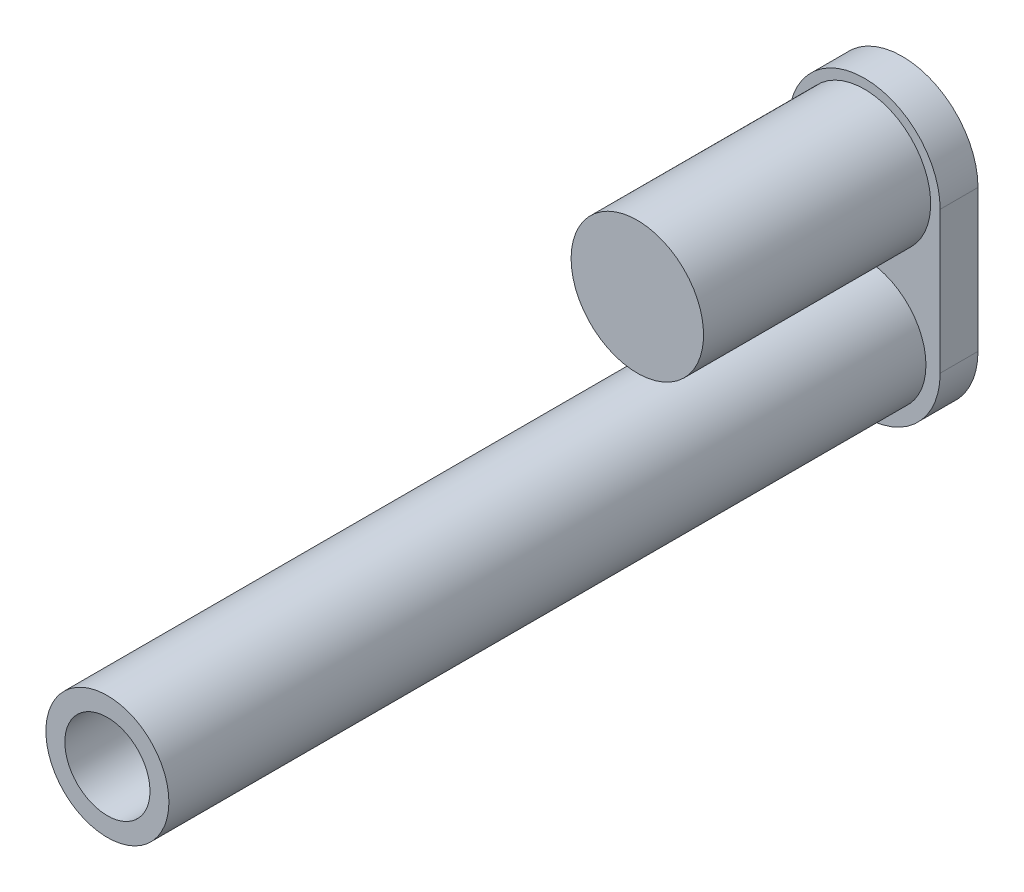
ISO-10303-21;
HEADER;
FILE_DESCRIPTION(('STEP AP214'),'2;1');
FILE_NAME('part.step','',(''),(''),'','','');
FILE_SCHEMA(('AUTOMOTIVE_DESIGN { 1 0 10303 214 1 1 1 1 }'));
ENDSEC;
DATA;
#1=APPLICATION_CONTEXT('core data for automotive mechanical design processes');
#2=APPLICATION_PROTOCOL_DEFINITION('international standard','automotive_design',2000,#1);
#3=PRODUCT_CONTEXT('',#1,'mechanical');
#4=PRODUCT('Part','Part','',(#3));
#5=PRODUCT_RELATED_PRODUCT_CATEGORY('part','',(#4));
#6=PRODUCT_DEFINITION_FORMATION('','',#4);
#7=PRODUCT_DEFINITION_CONTEXT('part definition',#1,'design');
#8=PRODUCT_DEFINITION('design','',#6,#7);
#9=PRODUCT_DEFINITION_SHAPE('','',#8);
#10=(LENGTH_UNIT() NAMED_UNIT(*) SI_UNIT(.MILLI.,.METRE.));
#11=(NAMED_UNIT(*) PLANE_ANGLE_UNIT() SI_UNIT($,.RADIAN.));
#12=(NAMED_UNIT(*) SI_UNIT($,.STERADIAN.) SOLID_ANGLE_UNIT());
#13=UNCERTAINTY_MEASURE_WITH_UNIT(LENGTH_MEASURE(1.E-05),#10,'distance_accuracy_value','');
#14=(GEOMETRIC_REPRESENTATION_CONTEXT(3) GLOBAL_UNCERTAINTY_ASSIGNED_CONTEXT((#13)) GLOBAL_UNIT_ASSIGNED_CONTEXT((#10,
#11,#12)) REPRESENTATION_CONTEXT('',''));
#15=CARTESIAN_POINT('',(0.,0.,0.));
#16=DIRECTION('',(0.,0.,1.));
#17=DIRECTION('',(1.,0.,0.));
#18=AXIS2_PLACEMENT_3D('',#15,#16,#17);
#19=CARTESIAN_POINT('',(0.,0.,0.));
#20=DIRECTION('',(0.,0.,1.));
#21=DIRECTION('',(1.,0.,0.));
#22=AXIS2_PLACEMENT_3D('',#19,#20,#21);
#23=PLANE('',#22);
#24=CARTESIAN_POINT('',(0.,0.,0.));
#25=DIRECTION('',(0.,0.,1.));
#26=DIRECTION('',(1.,0.,0.));
#27=AXIS2_PLACEMENT_3D('',#24,#25,#26);
#28=CIRCLE('',#27,25.4);
#29=CARTESIAN_POINT('',(-25.4,0.,0.));
#30=VERTEX_POINT('',#29);
#31=CARTESIAN_POINT('',(25.4,0.,0.));
#32=VERTEX_POINT('',#31);
#33=EDGE_CURVE('E160',#30,#32,#28,.T.);
#34=ORIENTED_EDGE('',*,*,#33,.F.);
#35=DIRECTION('',(0.,-1.,0.));
#36=VECTOR('',#35,1.);
#37=CARTESIAN_POINT('',(-25.4,0.,0.));
#38=LINE('',#37,#36);
#39=CARTESIAN_POINT('',(-25.4,47.625,0.));
#40=VERTEX_POINT('',#39);
#41=EDGE_CURVE('E84',#40,#30,#38,.T.);
#42=ORIENTED_EDGE('',*,*,#41,.F.);
#43=CARTESIAN_POINT('',(0.,47.625,0.));
#44=DIRECTION('',(0.,0.,1.));
#45=DIRECTION('',(1.,0.,0.));
#46=AXIS2_PLACEMENT_3D('',#43,#44,#45);
#47=CIRCLE('',#46,25.4);
#48=CARTESIAN_POINT('',(25.4,47.625,0.));
#49=VERTEX_POINT('',#48);
#50=EDGE_CURVE('E174',#49,#40,#47,.T.);
#51=ORIENTED_EDGE('',*,*,#50,.F.);
#52=DIRECTION('',(0.,1.,0.));
#53=VECTOR('',#52,1.);
#54=CARTESIAN_POINT('',(25.4,0.,0.));
#55=LINE('',#54,#53);
#56=EDGE_CURVE('E172',#32,#49,#55,.T.);
#57=ORIENTED_EDGE('',*,*,#56,.F.);
#58=EDGE_LOOP('',(#34,#42,#51,#57));
#59=FACE_BOUND('',#58,.T.);
#60=DIRECTION('',(0.,-1.,0.));
#61=VECTOR('',#60,1.);
#62=CARTESIAN_POINT('',(-6.35,6.35,0.));
#63=LINE('',#62,#61);
#64=CARTESIAN_POINT('',(-6.35,6.35,0.));
#65=VERTEX_POINT('',#64);
#66=CARTESIAN_POINT('',(-6.35,-6.35,0.));
#67=VERTEX_POINT('',#66);
#68=EDGE_CURVE('E133',#65,#67,#63,.T.);
#69=ORIENTED_EDGE('',*,*,#68,.T.);
#70=DIRECTION('',(1.,0.,0.));
#71=VECTOR('',#70,1.);
#72=CARTESIAN_POINT('',(-6.35,-6.35,0.));
#73=LINE('',#72,#71);
#74=CARTESIAN_POINT('',(6.35,-6.35,0.));
#75=VERTEX_POINT('',#74);
#76=EDGE_CURVE('E118',#67,#75,#73,.T.);
#77=ORIENTED_EDGE('',*,*,#76,.T.);
#78=DIRECTION('',(0.,-1.,0.));
#79=VECTOR('',#78,1.);
#80=CARTESIAN_POINT('',(6.35,6.35,0.));
#81=LINE('',#80,#79);
#82=CARTESIAN_POINT('',(6.35,6.35,0.));
#83=VERTEX_POINT('',#82);
#84=EDGE_CURVE('E123',#83,#75,#81,.T.);
#85=ORIENTED_EDGE('',*,*,#84,.F.);
#86=DIRECTION('',(1.,0.,0.));
#87=VECTOR('',#86,1.);
#88=CARTESIAN_POINT('',(-6.35,6.35,0.));
#89=LINE('',#88,#87);
#90=EDGE_CURVE('E150',#65,#83,#89,.T.);
#91=ORIENTED_EDGE('',*,*,#90,.F.);
#92=EDGE_LOOP('',(#69,#77,#85,#91));
#93=FACE_BOUND('',#92,.T.);
#94=ADVANCED_FACE('F39',(#59,#93),#23,.F.);
#95=CARTESIAN_POINT('',(0.,0.,12.7));
#96=DIRECTION('',(0.,0.,-1.));
#97=DIRECTION('',(-1.,0.,0.));
#98=AXIS2_PLACEMENT_3D('',#95,#96,#97);
#99=CYLINDRICAL_SURFACE('',#98,25.4);
#100=ORIENTED_EDGE('',*,*,#33,.T.);
#101=DIRECTION('',(0.,0.,-1.));
#102=VECTOR('',#101,1.);
#103=CARTESIAN_POINT('',(25.4,0.,12.7));
#104=LINE('',#103,#102);
#105=CARTESIAN_POINT('',(25.4,0.,12.7));
#106=VERTEX_POINT('',#105);
#107=EDGE_CURVE('E11',#106,#32,#104,.T.);
#108=ORIENTED_EDGE('',*,*,#107,.F.);
#109=CARTESIAN_POINT('',(0.,0.,12.7));
#110=DIRECTION('',(0.,0.,1.));
#111=DIRECTION('',(1.,0.,0.));
#112=AXIS2_PLACEMENT_3D('',#109,#110,#111);
#113=CIRCLE('',#112,25.4);
#114=CARTESIAN_POINT('',(-25.4,0.,12.7));
#115=VERTEX_POINT('',#114);
#116=EDGE_CURVE('E163',#115,#106,#113,.T.);
#117=ORIENTED_EDGE('',*,*,#116,.F.);
#118=DIRECTION('',(0.,0.,-1.));
#119=VECTOR('',#118,1.);
#120=CARTESIAN_POINT('',(-25.4,0.,12.7));
#121=LINE('',#120,#119);
#122=EDGE_CURVE('E169',#115,#30,#121,.T.);
#123=ORIENTED_EDGE('',*,*,#122,.T.);
#124=EDGE_LOOP('',(#100,#108,#117,#123));
#125=FACE_BOUND('',#124,.T.);
#126=ADVANCED_FACE('F41',(#125),#99,.T.);
#127=CARTESIAN_POINT('',(25.4,0.,12.7));
#128=DIRECTION('',(-1.,0.,0.));
#129=DIRECTION('',(0.,0.,1.));
#130=AXIS2_PLACEMENT_3D('',#127,#128,#129);
#131=PLANE('',#130);
#132=ORIENTED_EDGE('',*,*,#56,.T.);
#133=DIRECTION('',(0.,0.,-1.));
#134=VECTOR('',#133,1.);
#135=CARTESIAN_POINT('',(25.4,47.625,12.7));
#136=LINE('',#135,#134);
#137=CARTESIAN_POINT('',(25.4,47.625,12.7));
#138=VERTEX_POINT('',#137);
#139=EDGE_CURVE('E47',#138,#49,#136,.T.);
#140=ORIENTED_EDGE('',*,*,#139,.F.);
#141=DIRECTION('',(0.,1.,0.));
#142=VECTOR('',#141,1.);
#143=CARTESIAN_POINT('',(25.4,0.,12.7));
#144=LINE('',#143,#142);
#145=EDGE_CURVE('E91',#106,#138,#144,.T.);
#146=ORIENTED_EDGE('',*,*,#145,.F.);
#147=ORIENTED_EDGE('',*,*,#107,.T.);
#148=EDGE_LOOP('',(#132,#140,#146,#147));
#149=FACE_BOUND('',#148,.T.);
#150=ADVANCED_FACE('F202',(#149),#131,.F.);
#151=CARTESIAN_POINT('',(0.,47.625,12.7));
#152=DIRECTION('',(0.,0.,-1.));
#153=DIRECTION('',(-1.,0.,0.));
#154=AXIS2_PLACEMENT_3D('',#151,#152,#153);
#155=CYLINDRICAL_SURFACE('',#154,25.4);
#156=ORIENTED_EDGE('',*,*,#50,.T.);
#157=DIRECTION('',(0.,0.,-1.));
#158=VECTOR('',#157,1.);
#159=CARTESIAN_POINT('',(-25.4,47.625,12.7));
#160=LINE('',#159,#158);
#161=CARTESIAN_POINT('',(-25.4,47.625,12.7));
#162=VERTEX_POINT('',#161);
#163=EDGE_CURVE('E178',#162,#40,#160,.T.);
#164=ORIENTED_EDGE('',*,*,#163,.F.);
#165=CARTESIAN_POINT('',(0.,47.625,12.7));
#166=DIRECTION('',(0.,0.,1.));
#167=DIRECTION('',(1.,0.,0.));
#168=AXIS2_PLACEMENT_3D('',#165,#166,#167);
#169=CIRCLE('',#168,25.4);
#170=EDGE_CURVE('E166',#138,#162,#169,.T.);
#171=ORIENTED_EDGE('',*,*,#170,.F.);
#172=ORIENTED_EDGE('',*,*,#139,.T.);
#173=EDGE_LOOP('',(#156,#164,#171,#172));
#174=FACE_BOUND('',#173,.T.);
#175=ADVANCED_FACE('F183',(#174),#155,.T.);
#176=CARTESIAN_POINT('',(-25.4,0.,12.7));
#177=DIRECTION('',(1.,0.,0.));
#178=DIRECTION('',(0.,0.,-1.));
#179=AXIS2_PLACEMENT_3D('',#176,#177,#178);
#180=PLANE('',#179);
#181=ORIENTED_EDGE('',*,*,#41,.T.);
#182=ORIENTED_EDGE('',*,*,#122,.F.);
#183=DIRECTION('',(0.,-1.,0.));
#184=VECTOR('',#183,1.);
#185=CARTESIAN_POINT('',(-25.4,0.,12.7));
#186=LINE('',#185,#184);
#187=EDGE_CURVE('E63',#162,#115,#186,.T.);
#188=ORIENTED_EDGE('',*,*,#187,.F.);
#189=ORIENTED_EDGE('',*,*,#163,.T.);
#190=EDGE_LOOP('',(#181,#182,#188,#189));
#191=FACE_BOUND('',#190,.T.);
#192=ADVANCED_FACE('F190',(#191),#180,.F.);
#193=CARTESIAN_POINT('',(0.,0.,12.7));
#194=DIRECTION('',(0.,0.,1.));
#195=DIRECTION('',(1.,0.,0.));
#196=AXIS2_PLACEMENT_3D('',#193,#194,#195);
#197=PLANE('',#196);
#198=CARTESIAN_POINT('',(0.,0.,12.7));
#199=DIRECTION('',(0.,0.,1.));
#200=DIRECTION('',(1.,0.,0.));
#201=AXIS2_PLACEMENT_3D('',#198,#199,#200);
#202=CIRCLE('',#201,20.6375);
#203=CARTESIAN_POINT('',(20.6375,0.,12.7));
#204=VERTEX_POINT('',#203);
#205=EDGE_CURVE('E146',#204,#204,#202,.T.);
#206=ORIENTED_EDGE('',*,*,#205,.F.);
#207=EDGE_LOOP('',(#206));
#208=FACE_BOUND('',#207,.T.);
#209=CARTESIAN_POINT('',(0.,47.625,12.7));
#210=DIRECTION('',(0.,0.,1.));
#211=DIRECTION('',(1.,0.,0.));
#212=AXIS2_PLACEMENT_3D('',#209,#210,#211);
#213=CIRCLE('',#212,22.225);
#214=CARTESIAN_POINT('',(-22.225,47.625,12.7));
#215=VERTEX_POINT('',#214);
#216=EDGE_CURVE('E154',#215,#215,#213,.T.);
#217=ORIENTED_EDGE('',*,*,#216,.F.);
#218=EDGE_LOOP('',(#217));
#219=FACE_BOUND('',#218,.T.);
#220=ORIENTED_EDGE('',*,*,#116,.T.);
#221=ORIENTED_EDGE('',*,*,#145,.T.);
#222=ORIENTED_EDGE('',*,*,#170,.T.);
#223=ORIENTED_EDGE('',*,*,#187,.T.);
#224=EDGE_LOOP('',(#220,#221,#222,#223));
#225=FACE_BOUND('',#224,.T.);
#226=ADVANCED_FACE('F192',(#208,#219,#225),#197,.T.);
#227=CARTESIAN_POINT('',(0.,47.625,88.9));
#228=DIRECTION('',(0.,0.,-1.));
#229=DIRECTION('',(-1.,0.,0.));
#230=AXIS2_PLACEMENT_3D('',#227,#228,#229);
#231=CYLINDRICAL_SURFACE('',#230,22.225);
#232=CARTESIAN_POINT('',(0.,47.625,88.9));
#233=DIRECTION('',(0.,0.,1.));
#234=DIRECTION('',(1.,0.,0.));
#235=AXIS2_PLACEMENT_3D('',#232,#233,#234);
#236=CIRCLE('',#235,22.225);
#237=CARTESIAN_POINT('',(-22.225,47.625,88.9));
#238=VERTEX_POINT('',#237);
#239=EDGE_CURVE('E157',#238,#238,#236,.T.);
#240=CARTESIAN_POINT('',(-22.225,47.625,88.9));
#241=CARTESIAN_POINT('',(-22.225,47.625,88.10625));
#242=CARTESIAN_POINT('',(-22.225,47.625,87.3125));
#243=CARTESIAN_POINT('',(-22.225,47.625,85.725));
#244=CARTESIAN_POINT('',(-22.225,47.625,84.93125));
#245=CARTESIAN_POINT('',(-22.225,47.625,83.34375));
#246=CARTESIAN_POINT('',(-22.225,47.625,82.55));
#247=CARTESIAN_POINT('',(-22.225,47.625,80.9625));
#248=CARTESIAN_POINT('',(-22.225,47.625,80.16875));
#249=CARTESIAN_POINT('',(-22.225,47.625,78.58125));
#250=CARTESIAN_POINT('',(-22.225,47.625,77.7875));
#251=CARTESIAN_POINT('',(-22.225,47.625,76.2));
#252=CARTESIAN_POINT('',(-22.225,47.625,75.40625));
#253=CARTESIAN_POINT('',(-22.225,47.625,73.81875));
#254=CARTESIAN_POINT('',(-22.225,47.625,73.025));
#255=CARTESIAN_POINT('',(-22.225,47.625,71.4375));
#256=CARTESIAN_POINT('',(-22.225,47.625,70.64375));
#257=CARTESIAN_POINT('',(-22.225,47.625,69.05625));
#258=CARTESIAN_POINT('',(-22.225,47.625,68.2625));
#259=CARTESIAN_POINT('',(-22.225,47.625,66.675));
#260=CARTESIAN_POINT('',(-22.225,47.625,65.88125));
#261=CARTESIAN_POINT('',(-22.225,47.625,64.29375));
#262=CARTESIAN_POINT('',(-22.225,47.625,63.5));
#263=CARTESIAN_POINT('',(-22.225,47.625,61.9125));
#264=CARTESIAN_POINT('',(-22.225,47.625,61.11875));
#265=CARTESIAN_POINT('',(-22.225,47.625,59.53125));
#266=CARTESIAN_POINT('',(-22.225,47.625,58.7375));
#267=CARTESIAN_POINT('',(-22.225,47.625,57.15));
#268=CARTESIAN_POINT('',(-22.225,47.625,56.35625));
#269=CARTESIAN_POINT('',(-22.225,47.625,54.76875));
#270=CARTESIAN_POINT('',(-22.225,47.625,53.975));
#271=CARTESIAN_POINT('',(-22.225,47.625,52.3875));
#272=CARTESIAN_POINT('',(-22.225,47.625,51.59375));
#273=CARTESIAN_POINT('',(-22.225,47.625,50.00625));
#274=CARTESIAN_POINT('',(-22.225,47.625,49.2125));
#275=CARTESIAN_POINT('',(-22.225,47.625,47.625));
#276=CARTESIAN_POINT('',(-22.225,47.625,46.83125));
#277=CARTESIAN_POINT('',(-22.225,47.625,45.24375));
#278=CARTESIAN_POINT('',(-22.225,47.625,44.45));
#279=CARTESIAN_POINT('',(-22.225,47.625,42.8625));
#280=CARTESIAN_POINT('',(-22.225,47.625,42.06875));
#281=CARTESIAN_POINT('',(-22.225,47.625,40.48125));
#282=CARTESIAN_POINT('',(-22.225,47.625,39.6875));
#283=CARTESIAN_POINT('',(-22.225,47.625,38.1));
#284=CARTESIAN_POINT('',(-22.225,47.625,37.30625));
#285=CARTESIAN_POINT('',(-22.225,47.625,35.71875));
#286=CARTESIAN_POINT('',(-22.225,47.625,34.925));
#287=CARTESIAN_POINT('',(-22.225,47.625,33.3375));
#288=CARTESIAN_POINT('',(-22.225,47.625,32.54375));
#289=CARTESIAN_POINT('',(-22.225,47.625,30.95625));
#290=CARTESIAN_POINT('',(-22.225,47.625,30.1625));
#291=CARTESIAN_POINT('',(-22.225,47.625,28.575));
#292=CARTESIAN_POINT('',(-22.225,47.625,27.78125));
#293=CARTESIAN_POINT('',(-22.225,47.625,26.19375));
#294=CARTESIAN_POINT('',(-22.225,47.625,25.4));
#295=CARTESIAN_POINT('',(-22.225,47.625,23.8125));
#296=CARTESIAN_POINT('',(-22.225,47.625,23.01875));
#297=CARTESIAN_POINT('',(-22.225,47.625,21.43125));
#298=CARTESIAN_POINT('',(-22.225,47.625,20.6375));
#299=CARTESIAN_POINT('',(-22.225,47.625,19.05));
#300=CARTESIAN_POINT('',(-22.225,47.625,18.25625));
#301=CARTESIAN_POINT('',(-22.225,47.625,16.66875));
#302=CARTESIAN_POINT('',(-22.225,47.625,15.875));
#303=CARTESIAN_POINT('',(-22.225,47.625,14.2875));
#304=CARTESIAN_POINT('',(-22.225,47.625,13.49375));
#305=CARTESIAN_POINT('',(-22.225,47.625,12.7));
#306=B_SPLINE_CURVE_WITH_KNOTS('',3,(#240,#241,#242,#243,#244,#245,#246,#247,#248,#249,#250,
#251,#252,#253,#254,#255,#256,#257,#258,#259,#260,#261,#262,#263,#264,#265,#266,#267,#268,#269,
#270,#271,#272,#273,#274,#275,#276,#277,#278,#279,#280,#281,#282,#283,#284,#285,#286,#287,#288,
#289,#290,#291,#292,#293,#294,#295,#296,#297,#298,#299,#300,#301,#302,#303,#304,#305),
.UNSPECIFIED.,.F.,.F.,(4,2,2,2,2,2,2,2,2,2,2,2,2,2,2,2,2,2,2,2,2,2,2,2,2,2,2,2,2,2,2,2,4),(0.,
2.38124999999999,4.76249999999999,7.14374999999999,9.52499999999999,11.90625,14.2875,16.66875,
19.05,21.43125,23.8125,26.19375,28.575,30.95625,33.3375,35.71875,38.1,40.48125,42.8625,45.24375,
47.625,50.00625,52.3875,54.76875,57.15,59.53125,61.9125,64.29375,66.675,69.05625,71.4375,
73.81875,76.2),.UNSPECIFIED.);
#307=EDGE_CURVE('BSEAM199',#238,#215,#306,.T.);
#308=ORIENTED_EDGE('',*,*,#239,.F.);
#309=ORIENTED_EDGE('',*,*,#216,.T.);
#310=ORIENTED_EDGE('',*,*,#307,.T.);
#311=ORIENTED_EDGE('',*,*,#307,.F.);
#312=EDGE_LOOP('',(#308,#310,#309,#311));
#313=FACE_BOUND('',#312,.T.);
#314=ADVANCED_FACE('F199',(#313),#231,.T.);
#315=CARTESIAN_POINT('',(0.,47.625,88.9));
#316=DIRECTION('',(0.,0.,1.));
#317=DIRECTION('',(1.,0.,0.));
#318=AXIS2_PLACEMENT_3D('',#315,#316,#317);
#319=PLANE('',#318);
#320=ORIENTED_EDGE('',*,*,#239,.T.);
#321=EDGE_LOOP('',(#320));
#322=FACE_BOUND('',#321,.T.);
#323=ADVANCED_FACE('F213',(#322),#319,.T.);
#324=CARTESIAN_POINT('',(0.,0.,266.7));
#325=DIRECTION('',(0.,0.,-1.));
#326=DIRECTION('',(-1.,0.,0.));
#327=AXIS2_PLACEMENT_3D('',#324,#325,#326);
#328=CYLINDRICAL_SURFACE('',#327,20.6375);
#329=CARTESIAN_POINT('',(0.,0.,266.7));
#330=DIRECTION('',(0.,0.,1.));
#331=DIRECTION('',(1.,0.,0.));
#332=AXIS2_PLACEMENT_3D('',#329,#330,#331);
#333=CIRCLE('',#332,20.6375);
#334=CARTESIAN_POINT('',(20.6375,0.,266.7));
#335=VERTEX_POINT('',#334);
#336=EDGE_CURVE('E151',#335,#335,#333,.T.);
#337=ORIENTED_EDGE('',*,*,#336,.F.);
#338=EDGE_LOOP('',(#337));
#339=FACE_BOUND('',#338,.T.);
#340=ORIENTED_EDGE('',*,*,#205,.T.);
#341=EDGE_LOOP('',(#340));
#342=FACE_BOUND('',#341,.T.);
#343=ADVANCED_FACE('F217',(#339,#342),#328,.T.);
#344=CARTESIAN_POINT('',(0.,0.,266.7));
#345=DIRECTION('',(0.,0.,1.));
#346=DIRECTION('',(1.,0.,0.));
#347=AXIS2_PLACEMENT_3D('',#344,#345,#346);
#348=PLANE('',#347);
#349=CARTESIAN_POINT('',(0.,0.,266.7));
#350=DIRECTION('',(0.,0.,1.));
#351=DIRECTION('',(1.,0.,0.));
#352=AXIS2_PLACEMENT_3D('',#349,#350,#351);
#353=CIRCLE('',#352,14.2875);
#354=CARTESIAN_POINT('',(14.2875,0.,266.7));
#355=VERTEX_POINT('',#354);
#356=EDGE_CURVE('E147',#355,#355,#353,.T.);
#357=ORIENTED_EDGE('',*,*,#356,.F.);
#358=EDGE_LOOP('',(#357));
#359=FACE_BOUND('',#358,.T.);
#360=ORIENTED_EDGE('',*,*,#336,.T.);
#361=EDGE_LOOP('',(#360));
#362=FACE_BOUND('',#361,.T.);
#363=ADVANCED_FACE('F221',(#359,#362),#348,.T.);
#364=CARTESIAN_POINT('',(0.,0.,63.5));
#365=DIRECTION('',(0.,0.,1.));
#366=DIRECTION('',(1.,0.,0.));
#367=AXIS2_PLACEMENT_3D('',#364,#365,#366);
#368=CYLINDRICAL_SURFACE('',#367,14.2875);
#369=CARTESIAN_POINT('',(0.,0.,63.5));
#370=DIRECTION('',(0.,0.,1.));
#371=DIRECTION('',(1.,0.,0.));
#372=AXIS2_PLACEMENT_3D('',#369,#370,#371);
#373=CIRCLE('',#372,14.2875);
#374=CARTESIAN_POINT('',(14.2875,0.,63.5));
#375=VERTEX_POINT('',#374);
#376=EDGE_CURVE('E143',#375,#375,#373,.T.);
#377=ORIENTED_EDGE('',*,*,#376,.F.);
#378=EDGE_LOOP('',(#377));
#379=FACE_BOUND('',#378,.T.);
#380=ORIENTED_EDGE('',*,*,#356,.T.);
#381=EDGE_LOOP('',(#380));
#382=FACE_BOUND('',#381,.T.);
#383=ADVANCED_FACE('F225',(#379,#382),#368,.F.);
#384=CARTESIAN_POINT('',(0.,0.,63.5));
#385=DIRECTION('',(0.,0.,1.));
#386=DIRECTION('',(1.,0.,0.));
#387=AXIS2_PLACEMENT_3D('',#384,#385,#386);
#388=PLANE('',#387);
#389=ORIENTED_EDGE('',*,*,#376,.T.);
#390=EDGE_LOOP('',(#389));
#391=FACE_BOUND('',#390,.T.);
#392=ADVANCED_FACE('F229',(#391),#388,.T.);
#393=CARTESIAN_POINT('',(-6.35,6.35,0.));
#394=DIRECTION('',(0.,1.,0.));
#395=DIRECTION('',(0.,0.,1.));
#396=AXIS2_PLACEMENT_3D('',#393,#394,#395);
#397=PLANE('',#396);
#398=ORIENTED_EDGE('',*,*,#90,.T.);
#399=DIRECTION('',(0.,0.,1.));
#400=VECTOR('',#399,1.);
#401=CARTESIAN_POINT('',(6.35,6.35,0.));
#402=LINE('',#401,#400);
#403=CARTESIAN_POINT('',(6.35,6.35,-12.7));
#404=VERTEX_POINT('',#403);
#405=EDGE_CURVE('E54',#404,#83,#402,.T.);
#406=ORIENTED_EDGE('',*,*,#405,.F.);
#407=DIRECTION('',(1.,0.,0.));
#408=VECTOR('',#407,1.);
#409=CARTESIAN_POINT('',(-6.35,6.35,-12.7));
#410=LINE('',#409,#408);
#411=CARTESIAN_POINT('',(-6.35,6.35,-12.7));
#412=VERTEX_POINT('',#411);
#413=EDGE_CURVE('E136',#412,#404,#410,.T.);
#414=ORIENTED_EDGE('',*,*,#413,.F.);
#415=DIRECTION('',(0.,0.,1.));
#416=VECTOR('',#415,1.);
#417=CARTESIAN_POINT('',(-6.35,6.35,0.));
#418=LINE('',#417,#416);
#419=EDGE_CURVE('E134',#412,#65,#418,.T.);
#420=ORIENTED_EDGE('',*,*,#419,.T.);
#421=EDGE_LOOP('',(#398,#406,#414,#420));
#422=FACE_BOUND('',#421,.T.);
#423=ADVANCED_FACE('F232',(#422),#397,.T.);
#424=CARTESIAN_POINT('',(-6.35,6.35,-12.7));
#425=DIRECTION('',(0.,0.,-1.));
#426=DIRECTION('',(-1.,0.,0.));
#427=AXIS2_PLACEMENT_3D('',#424,#425,#426);
#428=PLANE('',#427);
#429=ORIENTED_EDGE('',*,*,#413,.T.);
#430=DIRECTION('',(0.,1.,0.));
#431=VECTOR('',#430,1.);
#432=CARTESIAN_POINT('',(6.35,6.35,-12.7));
#433=LINE('',#432,#431);
#434=CARTESIAN_POINT('',(6.35,-6.35,-12.7));
#435=VERTEX_POINT('',#434);
#436=EDGE_CURVE('E122',#435,#404,#433,.T.);
#437=ORIENTED_EDGE('',*,*,#436,.F.);
#438=DIRECTION('',(1.,0.,0.));
#439=VECTOR('',#438,1.);
#440=CARTESIAN_POINT('',(-6.35,-6.35,-12.7));
#441=LINE('',#440,#439);
#442=CARTESIAN_POINT('',(-6.35,-6.35,-12.7));
#443=VERTEX_POINT('',#442);
#444=EDGE_CURVE('E120',#443,#435,#441,.T.);
#445=ORIENTED_EDGE('',*,*,#444,.F.);
#446=DIRECTION('',(0.,1.,0.));
#447=VECTOR('',#446,1.);
#448=CARTESIAN_POINT('',(-6.35,6.35,-12.7));
#449=LINE('',#448,#447);
#450=EDGE_CURVE('E139',#443,#412,#449,.T.);
#451=ORIENTED_EDGE('',*,*,#450,.T.);
#452=EDGE_LOOP('',(#429,#437,#445,#451));
#453=FACE_BOUND('',#452,.T.);
#454=ADVANCED_FACE('F237',(#453),#428,.T.);
#455=CARTESIAN_POINT('',(-6.35,-6.35,0.));
#456=DIRECTION('',(0.,-1.,0.));
#457=DIRECTION('',(0.,0.,-1.));
#458=AXIS2_PLACEMENT_3D('',#455,#456,#457);
#459=PLANE('',#458);
#460=ORIENTED_EDGE('',*,*,#444,.T.);
#461=DIRECTION('',(0.,0.,-1.));
#462=VECTOR('',#461,1.);
#463=CARTESIAN_POINT('',(6.35,-6.35,0.));
#464=LINE('',#463,#462);
#465=EDGE_CURVE('E114',#75,#435,#464,.T.);
#466=ORIENTED_EDGE('',*,*,#465,.F.);
#467=ORIENTED_EDGE('',*,*,#76,.F.);
#468=DIRECTION('',(0.,0.,-1.));
#469=VECTOR('',#468,1.);
#470=CARTESIAN_POINT('',(-6.35,-6.35,0.));
#471=LINE('',#470,#469);
#472=EDGE_CURVE('E368',#67,#443,#471,.T.);
#473=ORIENTED_EDGE('',*,*,#472,.T.);
#474=EDGE_LOOP('',(#460,#466,#467,#473));
#475=FACE_BOUND('',#474,.T.);
#476=ADVANCED_FACE('F115',(#475),#459,.T.);
#477=CARTESIAN_POINT('',(-6.35,0.,0.));
#478=DIRECTION('',(1.,0.,0.));
#479=DIRECTION('',(0.,0.,-1.));
#480=AXIS2_PLACEMENT_3D('',#477,#478,#479);
#481=PLANE('',#480);
#482=CARTESIAN_POINT('',(-6.35,0.,-7.9375));
#483=DIRECTION('',(1.,0.,0.));
#484=DIRECTION('',(0.,0.,-1.));
#485=AXIS2_PLACEMENT_3D('',#482,#483,#484);
#486=CIRCLE('',#485,3.17500000000001);
#487=CARTESIAN_POINT('',(-6.35,0.,-11.1125));
#488=VERTEX_POINT('',#487);
#489=EDGE_CURVE('E359',#488,#488,#486,.T.);
#490=ORIENTED_EDGE('',*,*,#489,.T.);
#491=EDGE_LOOP('',(#490));
#492=FACE_BOUND('',#491,.T.);
#493=ORIENTED_EDGE('',*,*,#68,.F.);
#494=ORIENTED_EDGE('',*,*,#419,.F.);
#495=ORIENTED_EDGE('',*,*,#450,.F.);
#496=ORIENTED_EDGE('',*,*,#472,.F.);
#497=EDGE_LOOP('',(#493,#494,#495,#496));
#498=FACE_BOUND('',#497,.T.);
#499=ADVANCED_FACE('F236',(#492,#498),#481,.F.);
#500=CARTESIAN_POINT('',(-6.35,0.,-7.9375));
#501=DIRECTION('',(1.,0.,0.));
#502=DIRECTION('',(0.,0.,-1.));
#503=AXIS2_PLACEMENT_3D('',#500,#501,#502);
#504=CYLINDRICAL_SURFACE('',#503,3.17500000000001);
#505=ORIENTED_EDGE('',*,*,#489,.F.);
#506=EDGE_LOOP('',(#505));
#507=FACE_BOUND('',#506,.T.);
#508=CARTESIAN_POINT('',(6.35,0.,-7.9375));
#509=DIRECTION('',(1.,0.,0.));
#510=DIRECTION('',(0.,0.,-1.));
#511=AXIS2_PLACEMENT_3D('',#508,#509,#510);
#512=CIRCLE('',#511,3.17500000000001);
#513=CARTESIAN_POINT('',(6.35,0.,-11.1125));
#514=VERTEX_POINT('',#513);
#515=EDGE_CURVE('E130',#514,#514,#512,.T.);
#516=ORIENTED_EDGE('',*,*,#515,.T.);
#517=EDGE_LOOP('',(#516));
#518=FACE_BOUND('',#517,.T.);
#519=ADVANCED_FACE('F245',(#507,#518),#504,.F.);
#520=CARTESIAN_POINT('',(6.35,0.,0.));
#521=DIRECTION('',(1.,0.,0.));
#522=DIRECTION('',(0.,0.,-1.));
#523=AXIS2_PLACEMENT_3D('',#520,#521,#522);
#524=PLANE('',#523);
#525=ORIENTED_EDGE('',*,*,#84,.T.);
#526=ORIENTED_EDGE('',*,*,#465,.T.);
#527=ORIENTED_EDGE('',*,*,#436,.T.);
#528=ORIENTED_EDGE('',*,*,#405,.T.);
#529=EDGE_LOOP('',(#525,#526,#527,#528));
#530=FACE_BOUND('',#529,.T.);
#531=ORIENTED_EDGE('',*,*,#515,.F.);
#532=EDGE_LOOP('',(#531));
#533=FACE_BOUND('',#532,.T.);
#534=ADVANCED_FACE('F126',(#530,#533),#524,.T.);
#535=CLOSED_SHELL('',(#94,#126,#150,#175,#192,#226,#314,#323,#343,#363,#383,#392,#423,#454,#476,
#499,#519,#534));
#536=MANIFOLD_SOLID_BREP('B2',#535);
#537=ADVANCED_BREP_SHAPE_REPRESENTATION('',(#18,#536),#14);
#538=SHAPE_DEFINITION_REPRESENTATION(#9,#537);
ENDSEC;
END-ISO-10303-21;
